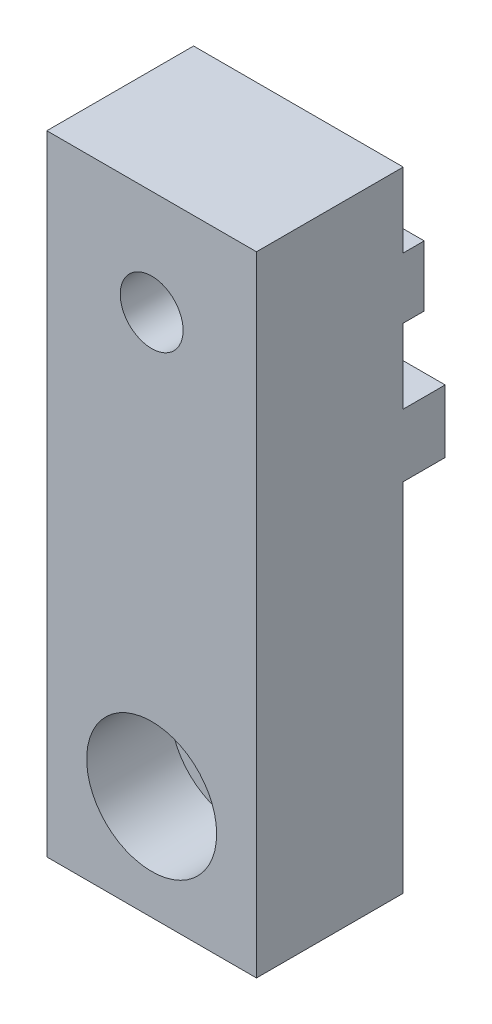
ISO-10303-21;
HEADER;
FILE_DESCRIPTION(('STEP AP214'),'2;1');
FILE_NAME('part.step','',(''),(''),'','','');
FILE_SCHEMA(('AUTOMOTIVE_DESIGN { 1 0 10303 214 1 1 1 1 }'));
ENDSEC;
DATA;
#1=APPLICATION_CONTEXT('core data for automotive mechanical design processes');
#2=APPLICATION_PROTOCOL_DEFINITION('international standard','automotive_design',2000,#1);
#3=PRODUCT_CONTEXT('',#1,'mechanical');
#4=PRODUCT('Part','Part','',(#3));
#5=PRODUCT_RELATED_PRODUCT_CATEGORY('part','',(#4));
#6=PRODUCT_DEFINITION_FORMATION('','',#4);
#7=PRODUCT_DEFINITION_CONTEXT('part definition',#1,'design');
#8=PRODUCT_DEFINITION('design','',#6,#7);
#9=PRODUCT_DEFINITION_SHAPE('','',#8);
#10=(LENGTH_UNIT() NAMED_UNIT(*) SI_UNIT(.MILLI.,.METRE.));
#11=(NAMED_UNIT(*) PLANE_ANGLE_UNIT() SI_UNIT($,.RADIAN.));
#12=(NAMED_UNIT(*) SI_UNIT($,.STERADIAN.) SOLID_ANGLE_UNIT());
#13=UNCERTAINTY_MEASURE_WITH_UNIT(LENGTH_MEASURE(1.E-05),#10,'distance_accuracy_value','');
#14=(GEOMETRIC_REPRESENTATION_CONTEXT(3) GLOBAL_UNCERTAINTY_ASSIGNED_CONTEXT((#13)) GLOBAL_UNIT_ASSIGNED_CONTEXT((#10,
#11,#12)) REPRESENTATION_CONTEXT('',''));
#15=CARTESIAN_POINT('',(0.,0.,0.));
#16=DIRECTION('',(0.,0.,1.));
#17=DIRECTION('',(1.,0.,0.));
#18=AXIS2_PLACEMENT_3D('',#15,#16,#17);
#19=CARTESIAN_POINT('',(0.,0.,0.));
#20=DIRECTION('',(0.,0.,-1.));
#21=DIRECTION('',(-1.,0.,0.));
#22=AXIS2_PLACEMENT_3D('',#19,#20,#21);
#23=PLANE('',#22);
#24=DIRECTION('',(0.,-1.,0.));
#25=VECTOR('',#24,1.);
#26=CARTESIAN_POINT('',(-5.,-15.,0.));
#27=LINE('',#26,#25);
#28=CARTESIAN_POINT('',(-5.,2.,0.));
#29=VERTEX_POINT('',#28);
#30=CARTESIAN_POINT('',(-5.,-15.,0.));
#31=VERTEX_POINT('',#30);
#32=EDGE_CURVE('E245',#29,#31,#27,.T.);
#33=ORIENTED_EDGE('',*,*,#32,.F.);
#34=DIRECTION('',(-1.,0.,0.));
#35=VECTOR('',#34,1.);
#36=CARTESIAN_POINT('',(5.,2.,0.));
#37=LINE('',#36,#35);
#38=CARTESIAN_POINT('',(5.,2.,0.));
#39=VERTEX_POINT('',#38);
#40=EDGE_CURVE('E312',#39,#29,#37,.T.);
#41=ORIENTED_EDGE('',*,*,#40,.F.);
#42=DIRECTION('',(0.,1.,0.));
#43=VECTOR('',#42,1.);
#44=CARTESIAN_POINT('',(5.,-15.,0.));
#45=LINE('',#44,#43);
#46=CARTESIAN_POINT('',(5.,-15.,0.));
#47=VERTEX_POINT('',#46);
#48=EDGE_CURVE('E167',#47,#39,#45,.T.);
#49=ORIENTED_EDGE('',*,*,#48,.F.);
#50=DIRECTION('',(1.,0.,0.));
#51=VECTOR('',#50,1.);
#52=CARTESIAN_POINT('',(-5.,-15.,0.));
#53=LINE('',#52,#51);
#54=EDGE_CURVE('E234',#31,#47,#53,.T.);
#55=ORIENTED_EDGE('',*,*,#54,.F.);
#56=EDGE_LOOP('',(#33,#41,#49,#55));
#57=FACE_BOUND('',#56,.T.);
#58=ADVANCED_FACE('F33',(#57),#23,.T.);
#59=CARTESIAN_POINT('',(5.,5.,0.));
#60=VERTEX_POINT('',#59);
#61=CARTESIAN_POINT('',(5.,8.55,0.));
#62=VERTEX_POINT('',#61);
#63=EDGE_CURVE('E243',#60,#62,#45,.T.);
#64=ORIENTED_EDGE('',*,*,#63,.F.);
#65=DIRECTION('',(1.,0.,0.));
#66=VECTOR('',#65,1.);
#67=CARTESIAN_POINT('',(5.,5.,0.));
#68=LINE('',#67,#66);
#69=CARTESIAN_POINT('',(-5.,5.,0.));
#70=VERTEX_POINT('',#69);
#71=EDGE_CURVE('E162',#70,#60,#68,.T.);
#72=ORIENTED_EDGE('',*,*,#71,.F.);
#73=CARTESIAN_POINT('',(-5.,8.55,0.));
#74=VERTEX_POINT('',#73);
#75=EDGE_CURVE('E249',#74,#70,#27,.T.);
#76=ORIENTED_EDGE('',*,*,#75,.F.);
#77=DIRECTION('',(-1.,0.,0.));
#78=VECTOR('',#77,1.);
#79=CARTESIAN_POINT('',(-5.,8.55,0.));
#80=LINE('',#79,#78);
#81=CARTESIAN_POINT('',(-0.384057287393434,8.55,0.));
#82=VERTEX_POINT('',#81);
#83=EDGE_CURVE('E209',#82,#74,#80,.T.);
#84=ORIENTED_EDGE('',*,*,#83,.F.);
#85=CARTESIAN_POINT('',(0.,10.,0.));
#86=DIRECTION('',(0.,0.,-1.));
#87=DIRECTION('',(-1.,0.,0.));
#88=AXIS2_PLACEMENT_3D('',#85,#86,#87);
#89=CIRCLE('',#88,1.5);
#90=CARTESIAN_POINT('',(0.38405728739343,8.55,0.));
#91=VERTEX_POINT('',#90);
#92=EDGE_CURVE('E179',#91,#82,#89,.T.);
#93=ORIENTED_EDGE('',*,*,#92,.F.);
#94=EDGE_CURVE('E195',#62,#91,#80,.T.);
#95=ORIENTED_EDGE('',*,*,#94,.F.);
#96=EDGE_LOOP('',(#64,#72,#76,#84,#93,#95));
#97=FACE_BOUND('',#96,.T.);
#98=ADVANCED_FACE('F280',(#97),#23,.T.);
#99=CARTESIAN_POINT('',(-5.,11.45,-1.));
#100=DIRECTION('',(0.,-1.,0.));
#101=DIRECTION('',(1.,0.,0.));
#102=AXIS2_PLACEMENT_3D('',#99,#100,#101);
#103=PLANE('',#102);
#104=DIRECTION('',(1.,0.,0.));
#105=VECTOR('',#104,1.);
#106=CARTESIAN_POINT('',(-5.,11.45,-1.));
#107=LINE('',#106,#105);
#108=CARTESIAN_POINT('',(0.384057287393428,11.45,-1.));
#109=VERTEX_POINT('',#108);
#110=CARTESIAN_POINT('',(5.,11.45,-1.));
#111=VERTEX_POINT('',#110);
#112=EDGE_CURVE('E194',#109,#111,#107,.T.);
#113=ORIENTED_EDGE('',*,*,#112,.F.);
#114=DIRECTION('',(0.,0.,1.));
#115=VECTOR('',#114,1.);
#116=CARTESIAN_POINT('',(0.384057287393431,11.45,-1.));
#117=LINE('',#116,#115);
#118=CARTESIAN_POINT('',(0.384057287393428,11.45,0.));
#119=VERTEX_POINT('',#118);
#120=EDGE_CURVE('E56',#109,#119,#117,.T.);
#121=ORIENTED_EDGE('',*,*,#120,.T.);
#122=DIRECTION('',(1.,0.,0.));
#123=VECTOR('',#122,1.);
#124=CARTESIAN_POINT('',(-5.,11.45,0.));
#125=LINE('',#124,#123);
#126=CARTESIAN_POINT('',(5.,11.45,0.));
#127=VERTEX_POINT('',#126);
#128=EDGE_CURVE('E190',#119,#127,#125,.T.);
#129=ORIENTED_EDGE('',*,*,#128,.T.);
#130=DIRECTION('',(0.,0.,1.));
#131=VECTOR('',#130,1.);
#132=CARTESIAN_POINT('',(5.,11.45,-1.));
#133=LINE('',#132,#131);
#134=EDGE_CURVE('E217',#111,#127,#133,.T.);
#135=ORIENTED_EDGE('',*,*,#134,.F.);
#136=EDGE_LOOP('',(#113,#121,#129,#135));
#137=FACE_BOUND('',#136,.T.);
#138=ADVANCED_FACE('F267',(#137),#103,.F.);
#139=CARTESIAN_POINT('',(-5.,8.55,-1.));
#140=DIRECTION('',(0.,1.,0.));
#141=DIRECTION('',(-1.,0.,0.));
#142=AXIS2_PLACEMENT_3D('',#139,#140,#141);
#143=PLANE('',#142);
#144=DIRECTION('',(-1.,0.,0.));
#145=VECTOR('',#144,1.);
#146=CARTESIAN_POINT('',(-5.,8.55,-1.));
#147=LINE('',#146,#145);
#148=CARTESIAN_POINT('',(-0.384057287393434,8.55,-1.));
#149=VERTEX_POINT('',#148);
#150=CARTESIAN_POINT('',(-5.,8.55,-1.));
#151=VERTEX_POINT('',#150);
#152=EDGE_CURVE('E201',#149,#151,#147,.T.);
#153=ORIENTED_EDGE('',*,*,#152,.F.);
#154=DIRECTION('',(0.,0.,1.));
#155=VECTOR('',#154,1.);
#156=CARTESIAN_POINT('',(-0.384057287393431,8.55,-1.));
#157=LINE('',#156,#155);
#158=EDGE_CURVE('E181',#149,#82,#157,.T.);
#159=ORIENTED_EDGE('',*,*,#158,.T.);
#160=ORIENTED_EDGE('',*,*,#83,.T.);
#161=DIRECTION('',(0.,0.,1.));
#162=VECTOR('',#161,1.);
#163=CARTESIAN_POINT('',(-5.,8.55,-1.));
#164=LINE('',#163,#162);
#165=EDGE_CURVE('E205',#151,#74,#164,.T.);
#166=ORIENTED_EDGE('',*,*,#165,.F.);
#167=EDGE_LOOP('',(#153,#159,#160,#166));
#168=FACE_BOUND('',#167,.T.);
#169=ADVANCED_FACE('F287',(#168),#143,.F.);
#170=CARTESIAN_POINT('',(0.,0.,-1.));
#171=DIRECTION('',(0.,0.,1.));
#172=DIRECTION('',(1.,0.,0.));
#173=AXIS2_PLACEMENT_3D('',#170,#171,#172);
#174=PLANE('',#173);
#175=CARTESIAN_POINT('',(-5.,11.45,-1.));
#176=VERTEX_POINT('',#175);
#177=CARTESIAN_POINT('',(-0.384057287393428,11.45,-1.));
#178=VERTEX_POINT('',#177);
#179=EDGE_CURVE('E196',#176,#178,#107,.T.);
#180=ORIENTED_EDGE('',*,*,#179,.T.);
#181=CARTESIAN_POINT('',(0.,10.,-1.));
#182=DIRECTION('',(0.,0.,1.));
#183=DIRECTION('',(1.,0.,0.));
#184=AXIS2_PLACEMENT_3D('',#181,#182,#183);
#185=CIRCLE('',#184,1.5);
#186=EDGE_CURVE('E11',#178,#149,#185,.T.);
#187=ORIENTED_EDGE('',*,*,#186,.T.);
#188=ORIENTED_EDGE('',*,*,#152,.T.);
#189=DIRECTION('',(0.,1.,0.));
#190=VECTOR('',#189,1.);
#191=CARTESIAN_POINT('',(-5.,11.45,-1.));
#192=LINE('',#191,#190);
#193=EDGE_CURVE('E191',#151,#176,#192,.T.);
#194=ORIENTED_EDGE('',*,*,#193,.T.);
#195=EDGE_LOOP('',(#180,#187,#188,#194));
#196=FACE_BOUND('',#195,.T.);
#197=ADVANCED_FACE('F290',(#196),#174,.F.);
#198=CARTESIAN_POINT('',(5.,-15.,7.));
#199=DIRECTION('',(-1.,0.,0.));
#200=DIRECTION('',(0.,0.,1.));
#201=AXIS2_PLACEMENT_3D('',#198,#199,#200);
#202=PLANE('',#201);
#203=ORIENTED_EDGE('',*,*,#48,.T.);
#204=DIRECTION('',(0.,0.,1.));
#205=VECTOR('',#204,1.);
#206=CARTESIAN_POINT('',(5.,2.,-2.));
#207=LINE('',#206,#205);
#208=CARTESIAN_POINT('',(5.,2.,-2.));
#209=VERTEX_POINT('',#208);
#210=EDGE_CURVE('E149',#209,#39,#207,.T.);
#211=ORIENTED_EDGE('',*,*,#210,.F.);
#212=DIRECTION('',(0.,-1.,0.));
#213=VECTOR('',#212,1.);
#214=CARTESIAN_POINT('',(5.,2.,-2.));
#215=LINE('',#214,#213);
#216=CARTESIAN_POINT('',(5.,5.,-2.));
#217=VERTEX_POINT('',#216);
#218=EDGE_CURVE('E153',#217,#209,#215,.T.);
#219=ORIENTED_EDGE('',*,*,#218,.F.);
#220=DIRECTION('',(0.,0.,1.));
#221=VECTOR('',#220,1.);
#222=CARTESIAN_POINT('',(5.,5.,-2.));
#223=LINE('',#222,#221);
#224=EDGE_CURVE('E318',#217,#60,#223,.T.);
#225=ORIENTED_EDGE('',*,*,#224,.T.);
#226=ORIENTED_EDGE('',*,*,#63,.T.);
#227=DIRECTION('',(0.,0.,1.));
#228=VECTOR('',#227,1.);
#229=CARTESIAN_POINT('',(5.,8.55,-1.));
#230=LINE('',#229,#228);
#231=CARTESIAN_POINT('',(5.,8.55,-1.));
#232=VERTEX_POINT('',#231);
#233=EDGE_CURVE('E214',#232,#62,#230,.T.);
#234=ORIENTED_EDGE('',*,*,#233,.F.);
#235=DIRECTION('',(0.,-1.,0.));
#236=VECTOR('',#235,1.);
#237=CARTESIAN_POINT('',(5.,11.45,-1.));
#238=LINE('',#237,#236);
#239=EDGE_CURVE('E199',#111,#232,#238,.T.);
#240=ORIENTED_EDGE('',*,*,#239,.F.);
#241=ORIENTED_EDGE('',*,*,#134,.T.);
#242=CARTESIAN_POINT('',(5.,15.,0.));
#243=VERTEX_POINT('',#242);
#244=EDGE_CURVE('E227',#127,#243,#45,.T.);
#245=ORIENTED_EDGE('',*,*,#244,.T.);
#246=DIRECTION('',(0.,0.,-1.));
#247=VECTOR('',#246,1.);
#248=CARTESIAN_POINT('',(5.,15.,7.));
#249=LINE('',#248,#247);
#250=CARTESIAN_POINT('',(5.,15.,7.));
#251=VERTEX_POINT('',#250);
#252=EDGE_CURVE('E257',#251,#243,#249,.T.);
#253=ORIENTED_EDGE('',*,*,#252,.F.);
#254=DIRECTION('',(0.,1.,0.));
#255=VECTOR('',#254,1.);
#256=CARTESIAN_POINT('',(5.,-15.,7.));
#257=LINE('',#256,#255);
#258=CARTESIAN_POINT('',(5.,-15.,7.));
#259=VERTEX_POINT('',#258);
#260=EDGE_CURVE('E230',#259,#251,#257,.T.);
#261=ORIENTED_EDGE('',*,*,#260,.F.);
#262=DIRECTION('',(0.,0.,-1.));
#263=VECTOR('',#262,1.);
#264=CARTESIAN_POINT('',(5.,-15.,7.));
#265=LINE('',#264,#263);
#266=EDGE_CURVE('E240',#259,#47,#265,.T.);
#267=ORIENTED_EDGE('',*,*,#266,.T.);
#268=EDGE_LOOP('',(#203,#211,#219,#225,#226,#234,#240,#241,#245,#253,#261,#267));
#269=FACE_BOUND('',#268,.T.);
#270=ADVANCED_FACE('F35',(#269),#202,.F.);
#271=CARTESIAN_POINT('',(-5.,15.,7.));
#272=DIRECTION('',(0.,-1.,0.));
#273=DIRECTION('',(0.,0.,-1.));
#274=AXIS2_PLACEMENT_3D('',#271,#272,#273);
#275=PLANE('',#274);
#276=DIRECTION('',(-1.,0.,0.));
#277=VECTOR('',#276,1.);
#278=CARTESIAN_POINT('',(-5.,15.,0.));
#279=LINE('',#278,#277);
#280=CARTESIAN_POINT('',(-5.,15.,0.));
#281=VERTEX_POINT('',#280);
#282=EDGE_CURVE('E242',#243,#281,#279,.T.);
#283=ORIENTED_EDGE('',*,*,#282,.T.);
#284=DIRECTION('',(0.,0.,-1.));
#285=VECTOR('',#284,1.);
#286=CARTESIAN_POINT('',(-5.,15.,7.));
#287=LINE('',#286,#285);
#288=CARTESIAN_POINT('',(-5.,15.,7.));
#289=VERTEX_POINT('',#288);
#290=EDGE_CURVE('E255',#289,#281,#287,.T.);
#291=ORIENTED_EDGE('',*,*,#290,.F.);
#292=DIRECTION('',(-1.,0.,0.));
#293=VECTOR('',#292,1.);
#294=CARTESIAN_POINT('',(-5.,15.,7.));
#295=LINE('',#294,#293);
#296=EDGE_CURVE('E233',#251,#289,#295,.T.);
#297=ORIENTED_EDGE('',*,*,#296,.F.);
#298=ORIENTED_EDGE('',*,*,#252,.T.);
#299=EDGE_LOOP('',(#283,#291,#297,#298));
#300=FACE_BOUND('',#299,.T.);
#301=ADVANCED_FACE('F323',(#300),#275,.F.);
#302=CARTESIAN_POINT('',(-5.,-15.,7.));
#303=DIRECTION('',(1.,0.,0.));
#304=DIRECTION('',(0.,0.,-1.));
#305=AXIS2_PLACEMENT_3D('',#302,#303,#304);
#306=PLANE('',#305);
#307=CARTESIAN_POINT('',(-5.,11.45,0.));
#308=VERTEX_POINT('',#307);
#309=EDGE_CURVE('E246',#281,#308,#27,.T.);
#310=ORIENTED_EDGE('',*,*,#309,.T.);
#311=DIRECTION('',(0.,0.,1.));
#312=VECTOR('',#311,1.);
#313=CARTESIAN_POINT('',(-5.,11.45,-1.));
#314=LINE('',#313,#312);
#315=EDGE_CURVE('E220',#176,#308,#314,.T.);
#316=ORIENTED_EDGE('',*,*,#315,.F.);
#317=ORIENTED_EDGE('',*,*,#193,.F.);
#318=ORIENTED_EDGE('',*,*,#165,.T.);
#319=ORIENTED_EDGE('',*,*,#75,.T.);
#320=DIRECTION('',(0.,0.,1.));
#321=VECTOR('',#320,1.);
#322=CARTESIAN_POINT('',(-5.,5.,-2.));
#323=LINE('',#322,#321);
#324=CARTESIAN_POINT('',(-5.,5.,-2.));
#325=VERTEX_POINT('',#324);
#326=EDGE_CURVE('E173',#325,#70,#323,.T.);
#327=ORIENTED_EDGE('',*,*,#326,.F.);
#328=DIRECTION('',(0.,1.,0.));
#329=VECTOR('',#328,1.);
#330=CARTESIAN_POINT('',(-5.,2.,-2.));
#331=LINE('',#330,#329);
#332=CARTESIAN_POINT('',(-5.,2.,-2.));
#333=VERTEX_POINT('',#332);
#334=EDGE_CURVE('E152',#333,#325,#331,.T.);
#335=ORIENTED_EDGE('',*,*,#334,.F.);
#336=DIRECTION('',(0.,0.,1.));
#337=VECTOR('',#336,1.);
#338=CARTESIAN_POINT('',(-5.,2.,-2.));
#339=LINE('',#338,#337);
#340=EDGE_CURVE('E48',#333,#29,#339,.T.);
#341=ORIENTED_EDGE('',*,*,#340,.T.);
#342=ORIENTED_EDGE('',*,*,#32,.T.);
#343=DIRECTION('',(0.,0.,-1.));
#344=VECTOR('',#343,1.);
#345=CARTESIAN_POINT('',(-5.,-15.,7.));
#346=LINE('',#345,#344);
#347=CARTESIAN_POINT('',(-5.,-15.,7.));
#348=VERTEX_POINT('',#347);
#349=EDGE_CURVE('E252',#348,#31,#346,.T.);
#350=ORIENTED_EDGE('',*,*,#349,.F.);
#351=DIRECTION('',(0.,-1.,0.));
#352=VECTOR('',#351,1.);
#353=CARTESIAN_POINT('',(-5.,-15.,7.));
#354=LINE('',#353,#352);
#355=EDGE_CURVE('E236',#289,#348,#354,.T.);
#356=ORIENTED_EDGE('',*,*,#355,.F.);
#357=ORIENTED_EDGE('',*,*,#290,.T.);
#358=EDGE_LOOP('',(#310,#316,#317,#318,#319,#327,#335,#341,#342,#350,#356,#357));
#359=FACE_BOUND('',#358,.T.);
#360=ADVANCED_FACE('F322',(#359),#306,.F.);
#361=CARTESIAN_POINT('',(-5.,-15.,7.));
#362=DIRECTION('',(0.,1.,0.));
#363=DIRECTION('',(0.,0.,1.));
#364=AXIS2_PLACEMENT_3D('',#361,#362,#363);
#365=PLANE('',#364);
#366=ORIENTED_EDGE('',*,*,#54,.T.);
#367=ORIENTED_EDGE('',*,*,#266,.F.);
#368=DIRECTION('',(1.,0.,0.));
#369=VECTOR('',#368,1.);
#370=CARTESIAN_POINT('',(-5.,-15.,7.));
#371=LINE('',#370,#369);
#372=EDGE_CURVE('E238',#348,#259,#371,.T.);
#373=ORIENTED_EDGE('',*,*,#372,.F.);
#374=ORIENTED_EDGE('',*,*,#349,.T.);
#375=EDGE_LOOP('',(#366,#367,#373,#374));
#376=FACE_BOUND('',#375,.T.);
#377=ADVANCED_FACE('F308',(#376),#365,.F.);
#378=CARTESIAN_POINT('',(0.,0.,7.));
#379=DIRECTION('',(0.,0.,-1.));
#380=DIRECTION('',(-1.,0.,0.));
#381=AXIS2_PLACEMENT_3D('',#378,#379,#380);
#382=PLANE('',#381);
#383=CARTESIAN_POINT('',(0.,10.,7.));
#384=DIRECTION('',(0.,0.,1.));
#385=DIRECTION('',(1.,0.,0.));
#386=AXIS2_PLACEMENT_3D('',#383,#384,#385);
#387=CIRCLE('',#386,1.5);
#388=CARTESIAN_POINT('',(1.5,10.,7.));
#389=VERTEX_POINT('',#388);
#390=EDGE_CURVE('E168',#389,#389,#387,.T.);
#391=ORIENTED_EDGE('',*,*,#390,.F.);
#392=EDGE_LOOP('',(#391));
#393=FACE_BOUND('',#392,.T.);
#394=CARTESIAN_POINT('',(0.,-10.,7.));
#395=DIRECTION('',(0.,0.,1.));
#396=DIRECTION('',(1.,0.,0.));
#397=AXIS2_PLACEMENT_3D('',#394,#395,#396);
#398=CIRCLE('',#397,3.1);
#399=CARTESIAN_POINT('',(3.1,-10.,7.));
#400=VERTEX_POINT('',#399);
#401=EDGE_CURVE('E223',#400,#400,#398,.T.);
#402=ORIENTED_EDGE('',*,*,#401,.F.);
#403=EDGE_LOOP('',(#402));
#404=FACE_BOUND('',#403,.T.);
#405=ORIENTED_EDGE('',*,*,#260,.T.);
#406=ORIENTED_EDGE('',*,*,#296,.T.);
#407=ORIENTED_EDGE('',*,*,#355,.T.);
#408=ORIENTED_EDGE('',*,*,#372,.T.);
#409=EDGE_LOOP('',(#405,#406,#407,#408));
#410=FACE_BOUND('',#409,.T.);
#411=ADVANCED_FACE('F302',(#393,#404,#410),#382,.F.);
#412=CARTESIAN_POINT('',(0.,10.,0.));
#413=DIRECTION('',(0.,0.,-1.));
#414=DIRECTION('',(-1.,0.,0.));
#415=AXIS2_PLACEMENT_3D('',#412,#413,#414);
#416=CIRCLE('',#415,1.5);
#417=CARTESIAN_POINT('',(-0.38405728739343,11.45,0.));
#418=VERTEX_POINT('',#417);
#419=EDGE_CURVE('E187',#418,#119,#416,.T.);
#420=ORIENTED_EDGE('',*,*,#419,.F.);
#421=EDGE_CURVE('E206',#308,#418,#125,.T.);
#422=ORIENTED_EDGE('',*,*,#421,.F.);
#423=ORIENTED_EDGE('',*,*,#309,.F.);
#424=ORIENTED_EDGE('',*,*,#282,.F.);
#425=ORIENTED_EDGE('',*,*,#244,.F.);
#426=ORIENTED_EDGE('',*,*,#128,.F.);
#427=EDGE_LOOP('',(#420,#422,#423,#424,#425,#426));
#428=FACE_BOUND('',#427,.T.);
#429=ADVANCED_FACE('F296',(#428),#23,.T.);
#430=CARTESIAN_POINT('',(0.,-10.,3.));
#431=DIRECTION('',(0.,0.,1.));
#432=DIRECTION('',(1.,0.,0.));
#433=AXIS2_PLACEMENT_3D('',#430,#431,#432);
#434=CYLINDRICAL_SURFACE('',#433,3.1);
#435=CARTESIAN_POINT('',(0.,-10.,3.));
#436=DIRECTION('',(0.,0.,1.));
#437=DIRECTION('',(1.,0.,0.));
#438=AXIS2_PLACEMENT_3D('',#435,#436,#437);
#439=CIRCLE('',#438,3.1);
#440=CARTESIAN_POINT('',(3.1,-10.,3.));
#441=VERTEX_POINT('',#440);
#442=EDGE_CURVE('E224',#441,#441,#439,.T.);
#443=ORIENTED_EDGE('',*,*,#442,.F.);
#444=EDGE_LOOP('',(#443));
#445=FACE_BOUND('',#444,.T.);
#446=ORIENTED_EDGE('',*,*,#401,.T.);
#447=EDGE_LOOP('',(#446));
#448=FACE_BOUND('',#447,.T.);
#449=ADVANCED_FACE('F341',(#445,#448),#434,.F.);
#450=CARTESIAN_POINT('',(0.,-10.,3.));
#451=DIRECTION('',(0.,0.,1.));
#452=DIRECTION('',(1.,0.,0.));
#453=AXIS2_PLACEMENT_3D('',#450,#451,#452);
#454=PLANE('',#453);
#455=ORIENTED_EDGE('',*,*,#442,.T.);
#456=EDGE_LOOP('',(#455));
#457=FACE_BOUND('',#456,.T.);
#458=ADVANCED_FACE('F346',(#457),#454,.T.);
#459=ORIENTED_EDGE('',*,*,#421,.T.);
#460=DIRECTION('',(0.,0.,1.));
#461=VECTOR('',#460,1.);
#462=CARTESIAN_POINT('',(-0.38405728739343,11.45,-1.));
#463=LINE('',#462,#461);
#464=EDGE_CURVE('E184',#418,#178,#463,.F.);
#465=ORIENTED_EDGE('',*,*,#464,.T.);
#466=ORIENTED_EDGE('',*,*,#179,.F.);
#467=ORIENTED_EDGE('',*,*,#315,.T.);
#468=EDGE_LOOP('',(#459,#465,#466,#467));
#469=FACE_BOUND('',#468,.T.);
#470=ADVANCED_FACE('F293',(#469),#103,.F.);
#471=ORIENTED_EDGE('',*,*,#94,.T.);
#472=DIRECTION('',(0.,0.,1.));
#473=VECTOR('',#472,1.);
#474=CARTESIAN_POINT('',(0.38405728739343,8.55,-1.));
#475=LINE('',#474,#473);
#476=CARTESIAN_POINT('',(0.384057287393433,8.55,-1.));
#477=VERTEX_POINT('',#476);
#478=EDGE_CURVE('E171',#91,#477,#475,.F.);
#479=ORIENTED_EDGE('',*,*,#478,.T.);
#480=EDGE_CURVE('E202',#232,#477,#147,.T.);
#481=ORIENTED_EDGE('',*,*,#480,.F.);
#482=ORIENTED_EDGE('',*,*,#233,.T.);
#483=EDGE_LOOP('',(#471,#479,#481,#482));
#484=FACE_BOUND('',#483,.T.);
#485=ADVANCED_FACE('F275',(#484),#143,.F.);
#486=ORIENTED_EDGE('',*,*,#480,.T.);
#487=EDGE_CURVE('E37',#477,#109,#185,.T.);
#488=ORIENTED_EDGE('',*,*,#487,.T.);
#489=ORIENTED_EDGE('',*,*,#112,.T.);
#490=ORIENTED_EDGE('',*,*,#239,.T.);
#491=EDGE_LOOP('',(#486,#488,#489,#490));
#492=FACE_BOUND('',#491,.T.);
#493=ADVANCED_FACE('F263',(#492),#174,.F.);
#494=CARTESIAN_POINT('',(0.,10.,-1.));
#495=DIRECTION('',(0.,0.,1.));
#496=DIRECTION('',(1.,0.,0.));
#497=AXIS2_PLACEMENT_3D('',#494,#495,#496);
#498=CYLINDRICAL_SURFACE('',#497,1.5);
#499=ORIENTED_EDGE('',*,*,#390,.T.);
#500=EDGE_LOOP('',(#499));
#501=FACE_BOUND('',#500,.T.);
#502=ORIENTED_EDGE('',*,*,#487,.F.);
#503=ORIENTED_EDGE('',*,*,#478,.F.);
#504=ORIENTED_EDGE('',*,*,#92,.T.);
#505=ORIENTED_EDGE('',*,*,#158,.F.);
#506=ORIENTED_EDGE('',*,*,#186,.F.);
#507=ORIENTED_EDGE('',*,*,#464,.F.);
#508=ORIENTED_EDGE('',*,*,#419,.T.);
#509=ORIENTED_EDGE('',*,*,#120,.F.);
#510=EDGE_LOOP('',(#502,#503,#504,#505,#506,#507,#508,#509));
#511=FACE_BOUND('',#510,.T.);
#512=ADVANCED_FACE('F277',(#501,#511),#498,.F.);
#513=CARTESIAN_POINT('',(5.,2.,-2.));
#514=DIRECTION('',(0.,1.,0.));
#515=DIRECTION('',(0.,0.,1.));
#516=AXIS2_PLACEMENT_3D('',#513,#514,#515);
#517=PLANE('',#516);
#518=ORIENTED_EDGE('',*,*,#40,.T.);
#519=ORIENTED_EDGE('',*,*,#340,.F.);
#520=DIRECTION('',(-1.,0.,0.));
#521=VECTOR('',#520,1.);
#522=CARTESIAN_POINT('',(5.,2.,-2.));
#523=LINE('',#522,#521);
#524=EDGE_CURVE('E145',#209,#333,#523,.T.);
#525=ORIENTED_EDGE('',*,*,#524,.F.);
#526=ORIENTED_EDGE('',*,*,#210,.T.);
#527=EDGE_LOOP('',(#518,#519,#525,#526));
#528=FACE_BOUND('',#527,.T.);
#529=ADVANCED_FACE('F147',(#528),#517,.F.);
#530=CARTESIAN_POINT('',(5.,5.,-2.));
#531=DIRECTION('',(0.,-1.,0.));
#532=DIRECTION('',(0.,0.,-1.));
#533=AXIS2_PLACEMENT_3D('',#530,#531,#532);
#534=PLANE('',#533);
#535=ORIENTED_EDGE('',*,*,#71,.T.);
#536=ORIENTED_EDGE('',*,*,#224,.F.);
#537=DIRECTION('',(1.,0.,0.));
#538=VECTOR('',#537,1.);
#539=CARTESIAN_POINT('',(5.,5.,-2.));
#540=LINE('',#539,#538);
#541=EDGE_CURVE('E158',#325,#217,#540,.T.);
#542=ORIENTED_EDGE('',*,*,#541,.F.);
#543=ORIENTED_EDGE('',*,*,#326,.T.);
#544=EDGE_LOOP('',(#535,#536,#542,#543));
#545=FACE_BOUND('',#544,.T.);
#546=ADVANCED_FACE('F321',(#545),#534,.F.);
#547=CARTESIAN_POINT('',(0.,0.,-2.));
#548=DIRECTION('',(0.,0.,1.));
#549=DIRECTION('',(1.,0.,0.));
#550=AXIS2_PLACEMENT_3D('',#547,#548,#549);
#551=PLANE('',#550);
#552=ORIENTED_EDGE('',*,*,#218,.T.);
#553=ORIENTED_EDGE('',*,*,#524,.T.);
#554=ORIENTED_EDGE('',*,*,#334,.T.);
#555=ORIENTED_EDGE('',*,*,#541,.T.);
#556=EDGE_LOOP('',(#552,#553,#554,#555));
#557=FACE_BOUND('',#556,.T.);
#558=ADVANCED_FACE('F156',(#557),#551,.F.);
#559=CLOSED_SHELL('',(#58,#98,#138,#169,#197,#270,#301,#360,#377,#411,#429,#449,#458,#470,#485,
#493,#512,#529,#546,#558));
#560=MANIFOLD_SOLID_BREP('B2',#559);
#561=ADVANCED_BREP_SHAPE_REPRESENTATION('',(#18,#560),#14);
#562=SHAPE_DEFINITION_REPRESENTATION(#9,#561);
ENDSEC;
END-ISO-10303-21;
